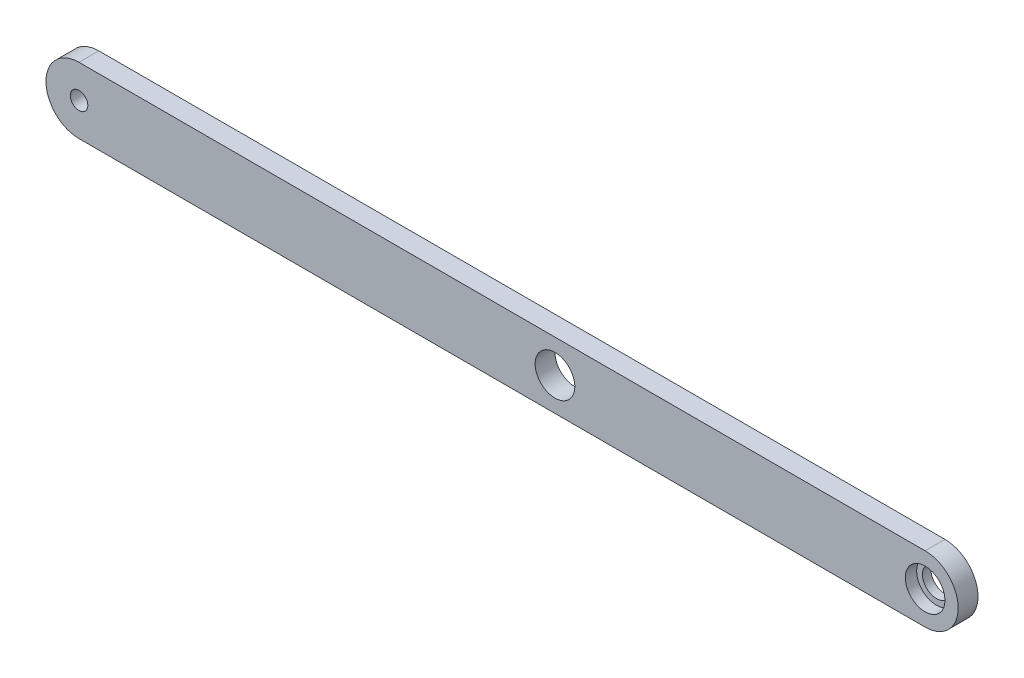
ISO-10303-21;
HEADER;
FILE_DESCRIPTION(('STEP AP214'),'2;1');
FILE_NAME('part.step','',(''),(''),'','','');
FILE_SCHEMA(('AUTOMOTIVE_DESIGN { 1 0 10303 214 1 1 1 1 }'));
ENDSEC;
DATA;
#1=APPLICATION_CONTEXT('core data for automotive mechanical design processes');
#2=APPLICATION_PROTOCOL_DEFINITION('international standard','automotive_design',2000,#1);
#3=PRODUCT_CONTEXT('',#1,'mechanical');
#4=PRODUCT('Part','Part','',(#3));
#5=PRODUCT_RELATED_PRODUCT_CATEGORY('part','',(#4));
#6=PRODUCT_DEFINITION_FORMATION('','',#4);
#7=PRODUCT_DEFINITION_CONTEXT('part definition',#1,'design');
#8=PRODUCT_DEFINITION('design','',#6,#7);
#9=PRODUCT_DEFINITION_SHAPE('','',#8);
#10=(LENGTH_UNIT() NAMED_UNIT(*) SI_UNIT(.MILLI.,.METRE.));
#11=(NAMED_UNIT(*) PLANE_ANGLE_UNIT() SI_UNIT($,.RADIAN.));
#12=(NAMED_UNIT(*) SI_UNIT($,.STERADIAN.) SOLID_ANGLE_UNIT());
#13=UNCERTAINTY_MEASURE_WITH_UNIT(LENGTH_MEASURE(1.E-05),#10,'distance_accuracy_value','');
#14=(GEOMETRIC_REPRESENTATION_CONTEXT(3) GLOBAL_UNCERTAINTY_ASSIGNED_CONTEXT((#13)) GLOBAL_UNIT_ASSIGNED_CONTEXT((#10,
#11,#12)) REPRESENTATION_CONTEXT('',''));
#15=CARTESIAN_POINT('',(0.,0.,0.));
#16=DIRECTION('',(0.,0.,1.));
#17=DIRECTION('',(1.,0.,0.));
#18=AXIS2_PLACEMENT_3D('',#15,#16,#17);
#19=CARTESIAN_POINT('',(0.,-7.93749999999999,4.7625));
#20=DIRECTION('',(0.,1.,0.));
#21=DIRECTION('',(0.,0.,1.));
#22=AXIS2_PLACEMENT_3D('',#19,#20,#21);
#23=PLANE('',#22);
#24=DIRECTION('',(1.,0.,0.));
#25=VECTOR('',#24,1.);
#26=CARTESIAN_POINT('',(0.,-7.93749999999999,0.));
#27=LINE('',#26,#25);
#28=CARTESIAN_POINT('',(-101.6,-7.93749999999999,0.));
#29=VERTEX_POINT('',#28);
#30=CARTESIAN_POINT('',(101.6,-7.93749999999999,0.));
#31=VERTEX_POINT('',#30);
#32=EDGE_CURVE('E113',#29,#31,#27,.T.);
#33=ORIENTED_EDGE('',*,*,#32,.T.);
#34=DIRECTION('',(0.,0.,-1.));
#35=VECTOR('',#34,1.);
#36=CARTESIAN_POINT('',(101.6,-7.93749999999999,4.7625));
#37=LINE('',#36,#35);
#38=CARTESIAN_POINT('',(101.6,-7.93749999999999,4.7625));
#39=VERTEX_POINT('',#38);
#40=EDGE_CURVE('E50',#39,#31,#37,.T.);
#41=ORIENTED_EDGE('',*,*,#40,.F.);
#42=DIRECTION('',(1.,0.,0.));
#43=VECTOR('',#42,1.);
#44=CARTESIAN_POINT('',(0.,-7.93749999999999,4.7625));
#45=LINE('',#44,#43);
#46=CARTESIAN_POINT('',(-101.6,-7.93749999999999,4.7625));
#47=VERTEX_POINT('',#46);
#48=EDGE_CURVE('E90',#47,#39,#45,.T.);
#49=ORIENTED_EDGE('',*,*,#48,.F.);
#50=DIRECTION('',(0.,0.,-1.));
#51=VECTOR('',#50,1.);
#52=CARTESIAN_POINT('',(-101.6,-7.93749999999999,4.7625));
#53=LINE('',#52,#51);
#54=EDGE_CURVE('E106',#47,#29,#53,.T.);
#55=ORIENTED_EDGE('',*,*,#54,.T.);
#56=EDGE_LOOP('',(#33,#41,#49,#55));
#57=FACE_BOUND('',#56,.T.);
#58=ADVANCED_FACE('F41',(#57),#23,.F.);
#59=CARTESIAN_POINT('',(101.6,0.,4.7625));
#60=DIRECTION('',(0.,0.,-1.));
#61=DIRECTION('',(-1.,0.,0.));
#62=AXIS2_PLACEMENT_3D('',#59,#60,#61);
#63=CYLINDRICAL_SURFACE('',#62,7.9375);
#64=CARTESIAN_POINT('',(101.6,0.,0.));
#65=DIRECTION('',(0.,0.,1.));
#66=DIRECTION('',(1.,0.,0.));
#67=AXIS2_PLACEMENT_3D('',#64,#65,#66);
#68=CIRCLE('',#67,7.9375);
#69=CARTESIAN_POINT('',(101.6,7.93750000000002,0.));
#70=VERTEX_POINT('',#69);
#71=EDGE_CURVE('E96',#31,#70,#68,.T.);
#72=ORIENTED_EDGE('',*,*,#71,.T.);
#73=DIRECTION('',(0.,0.,-1.));
#74=VECTOR('',#73,1.);
#75=CARTESIAN_POINT('',(101.6,7.93750000000002,4.7625));
#76=LINE('',#75,#74);
#77=CARTESIAN_POINT('',(101.6,7.93750000000002,4.7625));
#78=VERTEX_POINT('',#77);
#79=EDGE_CURVE('E94',#78,#70,#76,.T.);
#80=ORIENTED_EDGE('',*,*,#79,.F.);
#81=CARTESIAN_POINT('',(101.6,0.,4.7625));
#82=DIRECTION('',(0.,0.,1.));
#83=DIRECTION('',(1.,0.,0.));
#84=AXIS2_PLACEMENT_3D('',#81,#82,#83);
#85=CIRCLE('',#84,7.9375);
#86=EDGE_CURVE('E85',#39,#78,#85,.T.);
#87=ORIENTED_EDGE('',*,*,#86,.F.);
#88=ORIENTED_EDGE('',*,*,#40,.T.);
#89=EDGE_LOOP('',(#72,#80,#87,#88));
#90=FACE_BOUND('',#89,.T.);
#91=ADVANCED_FACE('F95',(#90),#63,.T.);
#92=CARTESIAN_POINT('',(0.,7.93750000000002,4.7625));
#93=DIRECTION('',(0.,1.,0.));
#94=DIRECTION('',(0.,0.,1.));
#95=AXIS2_PLACEMENT_3D('',#92,#93,#94);
#96=PLANE('',#95);
#97=DIRECTION('',(1.,0.,0.));
#98=VECTOR('',#97,1.);
#99=CARTESIAN_POINT('',(0.,7.93750000000002,0.));
#100=LINE('',#99,#98);
#101=CARTESIAN_POINT('',(-101.6,7.93750000000002,0.));
#102=VERTEX_POINT('',#101);
#103=EDGE_CURVE('E118',#102,#70,#100,.T.);
#104=ORIENTED_EDGE('',*,*,#103,.F.);
#105=DIRECTION('',(0.,0.,-1.));
#106=VECTOR('',#105,1.);
#107=CARTESIAN_POINT('',(-101.6,7.93750000000002,4.7625));
#108=LINE('',#107,#106);
#109=CARTESIAN_POINT('',(-101.6,7.93750000000002,4.7625));
#110=VERTEX_POINT('',#109);
#111=EDGE_CURVE('E74',#110,#102,#108,.T.);
#112=ORIENTED_EDGE('',*,*,#111,.F.);
#113=DIRECTION('',(1.,0.,0.));
#114=VECTOR('',#113,1.);
#115=CARTESIAN_POINT('',(0.,7.93750000000002,4.7625));
#116=LINE('',#115,#114);
#117=EDGE_CURVE('E88',#110,#78,#116,.T.);
#118=ORIENTED_EDGE('',*,*,#117,.T.);
#119=ORIENTED_EDGE('',*,*,#79,.T.);
#120=EDGE_LOOP('',(#104,#112,#118,#119));
#121=FACE_BOUND('',#120,.T.);
#122=ADVANCED_FACE('F101',(#121),#96,.T.);
#123=CARTESIAN_POINT('',(101.6,0.,4.7625));
#124=DIRECTION('',(0.,0.,-1.));
#125=DIRECTION('',(-1.,0.,0.));
#126=AXIS2_PLACEMENT_3D('',#123,#124,#125);
#127=CYLINDRICAL_SURFACE('',#126,4.7625);
#128=CARTESIAN_POINT('',(101.6,0.,2.032));
#129=DIRECTION('',(0.,0.,1.));
#130=DIRECTION('',(1.,0.,0.));
#131=AXIS2_PLACEMENT_3D('',#128,#129,#130);
#132=CIRCLE('',#131,4.7625);
#133=CARTESIAN_POINT('',(96.8375,0.,2.032));
#134=VERTEX_POINT('',#133);
#135=EDGE_CURVE('E11',#134,#134,#132,.T.);
#136=CARTESIAN_POINT('',(101.6,0.,4.7625));
#137=DIRECTION('',(0.,0.,1.));
#138=DIRECTION('',(1.,0.,0.));
#139=AXIS2_PLACEMENT_3D('',#136,#137,#138);
#140=CIRCLE('',#139,4.7625);
#141=CARTESIAN_POINT('',(96.8375,0.,4.7625));
#142=VERTEX_POINT('',#141);
#143=EDGE_CURVE('E146',#142,#142,#140,.T.);
#144=CARTESIAN_POINT('',(96.8375,0.,2.032));
#145=CARTESIAN_POINT('',(96.8375,0.,2.06044270833333));
#146=CARTESIAN_POINT('',(96.8375,0.,2.08888541666667));
#147=CARTESIAN_POINT('',(96.8375,0.,2.14577083333333));
#148=CARTESIAN_POINT('',(96.8375,0.,2.17421354166667));
#149=CARTESIAN_POINT('',(96.8375,0.,2.23109895833333));
#150=CARTESIAN_POINT('',(96.8375,0.,2.25954166666667));
#151=CARTESIAN_POINT('',(96.8375,0.,2.31642708333333));
#152=CARTESIAN_POINT('',(96.8375,0.,2.34486979166667));
#153=CARTESIAN_POINT('',(96.8375,0.,2.40175520833333));
#154=CARTESIAN_POINT('',(96.8375,0.,2.43019791666667));
#155=CARTESIAN_POINT('',(96.8375,0.,2.48708333333333));
#156=CARTESIAN_POINT('',(96.8375,0.,2.51552604166667));
#157=CARTESIAN_POINT('',(96.8375,0.,2.57241145833333));
#158=CARTESIAN_POINT('',(96.8375,0.,2.60085416666667));
#159=CARTESIAN_POINT('',(96.8375,0.,2.65773958333333));
#160=CARTESIAN_POINT('',(96.8375,0.,2.68618229166667));
#161=CARTESIAN_POINT('',(96.8375,0.,2.74306770833333));
#162=CARTESIAN_POINT('',(96.8375,0.,2.77151041666667));
#163=CARTESIAN_POINT('',(96.8375,0.,2.82839583333333));
#164=CARTESIAN_POINT('',(96.8375,0.,2.85683854166667));
#165=CARTESIAN_POINT('',(96.8375,0.,2.91372395833333));
#166=CARTESIAN_POINT('',(96.8375,0.,2.94216666666667));
#167=CARTESIAN_POINT('',(96.8375,0.,2.99905208333333));
#168=CARTESIAN_POINT('',(96.8375,0.,3.02749479166667));
#169=CARTESIAN_POINT('',(96.8375,0.,3.08438020833333));
#170=CARTESIAN_POINT('',(96.8375,0.,3.11282291666667));
#171=CARTESIAN_POINT('',(96.8375,0.,3.16970833333333));
#172=CARTESIAN_POINT('',(96.8375,0.,3.19815104166667));
#173=CARTESIAN_POINT('',(96.8375,0.,3.25503645833333));
#174=CARTESIAN_POINT('',(96.8375,0.,3.28347916666667));
#175=CARTESIAN_POINT('',(96.8375,0.,3.34036458333333));
#176=CARTESIAN_POINT('',(96.8375,0.,3.36880729166667));
#177=CARTESIAN_POINT('',(96.8375,0.,3.42569270833333));
#178=CARTESIAN_POINT('',(96.8375,0.,3.45413541666667));
#179=CARTESIAN_POINT('',(96.8375,0.,3.51102083333333));
#180=CARTESIAN_POINT('',(96.8375,0.,3.53946354166667));
#181=CARTESIAN_POINT('',(96.8375,0.,3.59634895833333));
#182=CARTESIAN_POINT('',(96.8375,0.,3.62479166666667));
#183=CARTESIAN_POINT('',(96.8375,0.,3.68167708333333));
#184=CARTESIAN_POINT('',(96.8375,0.,3.71011979166667));
#185=CARTESIAN_POINT('',(96.8375,0.,3.76700520833333));
#186=CARTESIAN_POINT('',(96.8375,0.,3.79544791666667));
#187=CARTESIAN_POINT('',(96.8375,0.,3.85233333333333));
#188=CARTESIAN_POINT('',(96.8375,0.,3.88077604166667));
#189=CARTESIAN_POINT('',(96.8375,0.,3.93766145833333));
#190=CARTESIAN_POINT('',(96.8375,0.,3.96610416666667));
#191=CARTESIAN_POINT('',(96.8375,0.,4.02298958333333));
#192=CARTESIAN_POINT('',(96.8375,0.,4.05143229166667));
#193=CARTESIAN_POINT('',(96.8375,0.,4.10831770833333));
#194=CARTESIAN_POINT('',(96.8375,0.,4.13676041666667));
#195=CARTESIAN_POINT('',(96.8375,0.,4.19364583333333));
#196=CARTESIAN_POINT('',(96.8375,0.,4.22208854166667));
#197=CARTESIAN_POINT('',(96.8375,0.,4.27897395833333));
#198=CARTESIAN_POINT('',(96.8375,0.,4.30741666666667));
#199=CARTESIAN_POINT('',(96.8375,0.,4.36430208333333));
#200=CARTESIAN_POINT('',(96.8375,0.,4.39274479166667));
#201=CARTESIAN_POINT('',(96.8375,0.,4.44963020833333));
#202=CARTESIAN_POINT('',(96.8375,0.,4.47807291666667));
#203=CARTESIAN_POINT('',(96.8375,0.,4.53495833333333));
#204=CARTESIAN_POINT('',(96.8375,0.,4.56340104166667));
#205=CARTESIAN_POINT('',(96.8375,0.,4.62028645833333));
#206=CARTESIAN_POINT('',(96.8375,0.,4.64872916666667));
#207=CARTESIAN_POINT('',(96.8375,0.,4.70561458333333));
#208=CARTESIAN_POINT('',(96.8375,0.,4.73405729166667));
#209=CARTESIAN_POINT('',(96.8375,0.,4.7625));
#210=B_SPLINE_CURVE_WITH_KNOTS('',3,(#144,#145,#146,#147,#148,#149,#150,#151,#152,#153,#154,
#155,#156,#157,#158,#159,#160,#161,#162,#163,#164,#165,#166,#167,#168,#169,#170,#171,#172,#173,
#174,#175,#176,#177,#178,#179,#180,#181,#182,#183,#184,#185,#186,#187,#188,#189,#190,#191,#192,
#193,#194,#195,#196,#197,#198,#199,#200,#201,#202,#203,#204,#205,#206,#207,#208,#209),
.UNSPECIFIED.,.F.,.F.,(4,2,2,2,2,2,2,2,2,2,2,2,2,2,2,2,2,2,2,2,2,2,2,2,2,2,2,2,2,2,2,2,4),(0.,
0.0853281249999999,0.17065625,0.255984375,0.3413125,0.426640625,0.51196875,0.597296875,0.682625,
0.767953125,0.85328125,0.938609375,1.0239375,1.109265625,1.19459375,1.279921875,1.36525,
1.450578125,1.53590625,1.621234375,1.7065625,1.791890625,1.87721875,1.962546875,2.047875,
2.133203125,2.21853125,2.303859375,2.3891875,2.474515625,2.55984375,2.645171875,2.7305),.UNSPECIFIED.);
#211=EDGE_CURVE('BSEAM151',#134,#142,#210,.T.);
#212=ORIENTED_EDGE('',*,*,#135,.F.);
#213=ORIENTED_EDGE('',*,*,#143,.T.);
#214=ORIENTED_EDGE('',*,*,#211,.T.);
#215=ORIENTED_EDGE('',*,*,#211,.F.);
#216=EDGE_LOOP('',(#212,#214,#213,#215));
#217=FACE_BOUND('',#216,.T.);
#218=ADVANCED_FACE('F151',(#217),#127,.F.);
#219=CARTESIAN_POINT('',(12.7,0.,4.7625));
#220=DIRECTION('',(0.,0.,-1.));
#221=DIRECTION('',(-1.,0.,0.));
#222=AXIS2_PLACEMENT_3D('',#219,#220,#221);
#223=CYLINDRICAL_SURFACE('',#222,4.7625);
#224=CARTESIAN_POINT('',(12.7,0.,4.7625));
#225=DIRECTION('',(0.,0.,1.));
#226=DIRECTION('',(1.,0.,0.));
#227=AXIS2_PLACEMENT_3D('',#224,#225,#226);
#228=CIRCLE('',#227,4.7625);
#229=CARTESIAN_POINT('',(7.9375,0.,4.7625));
#230=VERTEX_POINT('',#229);
#231=EDGE_CURVE('E121',#230,#230,#228,.T.);
#232=CARTESIAN_POINT('',(12.7,0.,0.));
#233=DIRECTION('',(0.,0.,1.));
#234=DIRECTION('',(1.,0.,0.));
#235=AXIS2_PLACEMENT_3D('',#232,#233,#234);
#236=CIRCLE('',#235,4.7625);
#237=CARTESIAN_POINT('',(7.9375,0.,0.));
#238=VERTEX_POINT('',#237);
#239=EDGE_CURVE('E110',#238,#238,#236,.T.);
#240=CARTESIAN_POINT('',(7.9375,0.,4.7625));
#241=CARTESIAN_POINT('',(7.9375,0.,4.712890625));
#242=CARTESIAN_POINT('',(7.9375,0.,4.66328125));
#243=CARTESIAN_POINT('',(7.9375,0.,4.5640625));
#244=CARTESIAN_POINT('',(7.9375,0.,4.514453125));
#245=CARTESIAN_POINT('',(7.9375,0.,4.415234375));
#246=CARTESIAN_POINT('',(7.9375,0.,4.365625));
#247=CARTESIAN_POINT('',(7.9375,0.,4.26640625));
#248=CARTESIAN_POINT('',(7.9375,0.,4.216796875));
#249=CARTESIAN_POINT('',(7.9375,0.,4.117578125));
#250=CARTESIAN_POINT('',(7.9375,0.,4.06796875));
#251=CARTESIAN_POINT('',(7.9375,0.,3.96875));
#252=CARTESIAN_POINT('',(7.9375,0.,3.919140625));
#253=CARTESIAN_POINT('',(7.9375,0.,3.819921875));
#254=CARTESIAN_POINT('',(7.9375,0.,3.7703125));
#255=CARTESIAN_POINT('',(7.9375,0.,3.67109375));
#256=CARTESIAN_POINT('',(7.9375,0.,3.621484375));
#257=CARTESIAN_POINT('',(7.9375,0.,3.522265625));
#258=CARTESIAN_POINT('',(7.9375,0.,3.47265625));
#259=CARTESIAN_POINT('',(7.9375,0.,3.3734375));
#260=CARTESIAN_POINT('',(7.9375,0.,3.323828125));
#261=CARTESIAN_POINT('',(7.9375,0.,3.224609375));
#262=CARTESIAN_POINT('',(7.9375,0.,3.175));
#263=CARTESIAN_POINT('',(7.9375,0.,3.07578125));
#264=CARTESIAN_POINT('',(7.9375,0.,3.026171875));
#265=CARTESIAN_POINT('',(7.9375,0.,2.926953125));
#266=CARTESIAN_POINT('',(7.9375,0.,2.87734375));
#267=CARTESIAN_POINT('',(7.9375,0.,2.778125));
#268=CARTESIAN_POINT('',(7.9375,0.,2.728515625));
#269=CARTESIAN_POINT('',(7.9375,0.,2.629296875));
#270=CARTESIAN_POINT('',(7.9375,0.,2.5796875));
#271=CARTESIAN_POINT('',(7.9375,0.,2.48046875));
#272=CARTESIAN_POINT('',(7.9375,0.,2.430859375));
#273=CARTESIAN_POINT('',(7.9375,0.,2.331640625));
#274=CARTESIAN_POINT('',(7.9375,0.,2.28203125));
#275=CARTESIAN_POINT('',(7.9375,0.,2.1828125));
#276=CARTESIAN_POINT('',(7.9375,0.,2.133203125));
#277=CARTESIAN_POINT('',(7.9375,0.,2.033984375));
#278=CARTESIAN_POINT('',(7.9375,0.,1.984375));
#279=CARTESIAN_POINT('',(7.9375,0.,1.88515625));
#280=CARTESIAN_POINT('',(7.9375,0.,1.835546875));
#281=CARTESIAN_POINT('',(7.9375,0.,1.736328125));
#282=CARTESIAN_POINT('',(7.9375,0.,1.68671875));
#283=CARTESIAN_POINT('',(7.9375,0.,1.5875));
#284=CARTESIAN_POINT('',(7.9375,0.,1.537890625));
#285=CARTESIAN_POINT('',(7.9375,0.,1.438671875));
#286=CARTESIAN_POINT('',(7.9375,0.,1.3890625));
#287=CARTESIAN_POINT('',(7.9375,0.,1.28984375));
#288=CARTESIAN_POINT('',(7.9375,0.,1.240234375));
#289=CARTESIAN_POINT('',(7.9375,0.,1.141015625));
#290=CARTESIAN_POINT('',(7.9375,0.,1.09140625));
#291=CARTESIAN_POINT('',(7.9375,0.,0.992187499999999));
#292=CARTESIAN_POINT('',(7.9375,0.,0.942578124999999));
#293=CARTESIAN_POINT('',(7.9375,0.,0.843359375));
#294=CARTESIAN_POINT('',(7.9375,0.,0.79375));
#295=CARTESIAN_POINT('',(7.9375,0.,0.69453125));
#296=CARTESIAN_POINT('',(7.9375,0.,0.644921875));
#297=CARTESIAN_POINT('',(7.9375,0.,0.545703125));
#298=CARTESIAN_POINT('',(7.9375,0.,0.49609375));
#299=CARTESIAN_POINT('',(7.9375,0.,0.396875));
#300=CARTESIAN_POINT('',(7.9375,0.,0.347265625));
#301=CARTESIAN_POINT('',(7.9375,0.,0.248046875));
#302=CARTESIAN_POINT('',(7.9375,0.,0.1984375));
#303=CARTESIAN_POINT('',(7.9375,0.,0.09921875));
#304=CARTESIAN_POINT('',(7.9375,0.,0.049609375));
#305=CARTESIAN_POINT('',(7.9375,0.,0.));
#306=B_SPLINE_CURVE_WITH_KNOTS('',3,(#240,#241,#242,#243,#244,#245,#246,#247,#248,#249,#250,
#251,#252,#253,#254,#255,#256,#257,#258,#259,#260,#261,#262,#263,#264,#265,#266,#267,#268,#269,
#270,#271,#272,#273,#274,#275,#276,#277,#278,#279,#280,#281,#282,#283,#284,#285,#286,#287,#288,
#289,#290,#291,#292,#293,#294,#295,#296,#297,#298,#299,#300,#301,#302,#303,#304,#305),
.UNSPECIFIED.,.F.,.F.,(4,2,2,2,2,2,2,2,2,2,2,2,2,2,2,2,2,2,2,2,2,2,2,2,2,2,2,2,2,2,2,2,4),(0.,
0.148828125,0.29765625,0.446484375,0.5953125,0.744140625,0.892968750000001,1.041796875,1.190625,
1.339453125,1.48828125,1.637109375,1.7859375,1.934765625,2.08359375,2.232421875,2.38125,
2.530078125,2.67890625,2.827734375,2.9765625,3.125390625,3.27421875,3.423046875,3.571875,
3.720703125,3.86953125,4.018359375,4.1671875,4.316015625,4.46484375,4.613671875,4.7625),.UNSPECIFIED.);
#307=EDGE_CURVE('BSEAM43',#230,#238,#306,.T.);
#308=ORIENTED_EDGE('',*,*,#231,.T.);
#309=ORIENTED_EDGE('',*,*,#239,.F.);
#310=ORIENTED_EDGE('',*,*,#307,.T.);
#311=ORIENTED_EDGE('',*,*,#307,.F.);
#312=EDGE_LOOP('',(#308,#310,#309,#311));
#313=FACE_BOUND('',#312,.T.);
#314=ADVANCED_FACE('F43',(#313),#223,.F.);
#315=CARTESIAN_POINT('',(-101.6,0.,4.7625));
#316=DIRECTION('',(0.,0.,-1.));
#317=DIRECTION('',(-1.,0.,0.));
#318=AXIS2_PLACEMENT_3D('',#315,#316,#317);
#319=CYLINDRICAL_SURFACE('',#318,7.9375);
#320=CARTESIAN_POINT('',(-101.6,0.,0.));
#321=DIRECTION('',(0.,0.,1.));
#322=DIRECTION('',(1.,0.,0.));
#323=AXIS2_PLACEMENT_3D('',#320,#321,#322);
#324=CIRCLE('',#323,7.9375);
#325=EDGE_CURVE('E77',#102,#29,#324,.T.);
#326=ORIENTED_EDGE('',*,*,#325,.T.);
#327=ORIENTED_EDGE('',*,*,#54,.F.);
#328=CARTESIAN_POINT('',(-101.6,0.,4.7625));
#329=DIRECTION('',(0.,0.,1.));
#330=DIRECTION('',(1.,0.,0.));
#331=AXIS2_PLACEMENT_3D('',#328,#329,#330);
#332=CIRCLE('',#331,7.9375);
#333=EDGE_CURVE('E58',#110,#47,#332,.T.);
#334=ORIENTED_EDGE('',*,*,#333,.F.);
#335=ORIENTED_EDGE('',*,*,#111,.T.);
#336=EDGE_LOOP('',(#326,#327,#334,#335));
#337=FACE_BOUND('',#336,.T.);
#338=ADVANCED_FACE('F154',(#337),#319,.T.);
#339=CARTESIAN_POINT('',(0.,0.,4.7625));
#340=DIRECTION('',(0.,0.,1.));
#341=DIRECTION('',(1.,0.,0.));
#342=AXIS2_PLACEMENT_3D('',#339,#340,#341);
#343=PLANE('',#342);
#344=CARTESIAN_POINT('',(-101.6,0.,4.7625));
#345=DIRECTION('',(0.,0.,1.));
#346=DIRECTION('',(1.,0.,0.));
#347=AXIS2_PLACEMENT_3D('',#344,#345,#346);
#348=CIRCLE('',#347,2.1);
#349=CARTESIAN_POINT('',(-99.5,0.,4.7625));
#350=VERTEX_POINT('',#349);
#351=EDGE_CURVE('E141',#350,#350,#348,.T.);
#352=ORIENTED_EDGE('',*,*,#351,.F.);
#353=EDGE_LOOP('',(#352));
#354=FACE_BOUND('',#353,.T.);
#355=ORIENTED_EDGE('',*,*,#231,.F.);
#356=EDGE_LOOP('',(#355));
#357=FACE_BOUND('',#356,.T.);
#358=ORIENTED_EDGE('',*,*,#143,.F.);
#359=EDGE_LOOP('',(#358));
#360=FACE_BOUND('',#359,.T.);
#361=ORIENTED_EDGE('',*,*,#48,.T.);
#362=ORIENTED_EDGE('',*,*,#86,.T.);
#363=ORIENTED_EDGE('',*,*,#117,.F.);
#364=ORIENTED_EDGE('',*,*,#333,.T.);
#365=EDGE_LOOP('',(#361,#362,#363,#364));
#366=FACE_BOUND('',#365,.T.);
#367=ADVANCED_FACE('F86',(#354,#357,#360,#366),#343,.T.);
#368=CARTESIAN_POINT('',(0.,0.,0.));
#369=DIRECTION('',(0.,0.,1.));
#370=DIRECTION('',(1.,0.,0.));
#371=AXIS2_PLACEMENT_3D('',#368,#369,#370);
#372=PLANE('',#371);
#373=CARTESIAN_POINT('',(-101.6,0.,0.));
#374=DIRECTION('',(0.,0.,1.));
#375=DIRECTION('',(1.,0.,0.));
#376=AXIS2_PLACEMENT_3D('',#373,#374,#375);
#377=CIRCLE('',#376,2.1);
#378=CARTESIAN_POINT('',(-99.5,0.,0.));
#379=VERTEX_POINT('',#378);
#380=EDGE_CURVE('E136',#379,#379,#377,.T.);
#381=ORIENTED_EDGE('',*,*,#380,.T.);
#382=EDGE_LOOP('',(#381));
#383=FACE_BOUND('',#382,.T.);
#384=ORIENTED_EDGE('',*,*,#239,.T.);
#385=EDGE_LOOP('',(#384));
#386=FACE_BOUND('',#385,.T.);
#387=ORIENTED_EDGE('',*,*,#32,.F.);
#388=ORIENTED_EDGE('',*,*,#325,.F.);
#389=ORIENTED_EDGE('',*,*,#103,.T.);
#390=ORIENTED_EDGE('',*,*,#71,.F.);
#391=EDGE_LOOP('',(#387,#388,#389,#390));
#392=FACE_BOUND('',#391,.T.);
#393=CARTESIAN_POINT('',(101.6,0.,0.));
#394=DIRECTION('',(0.,0.,1.));
#395=DIRECTION('',(1.,0.,0.));
#396=AXIS2_PLACEMENT_3D('',#393,#394,#395);
#397=CIRCLE('',#396,3.3734375);
#398=CARTESIAN_POINT('',(104.9734375,0.,0.));
#399=VERTEX_POINT('',#398);
#400=EDGE_CURVE('E134',#399,#399,#397,.T.);
#401=ORIENTED_EDGE('',*,*,#400,.T.);
#402=EDGE_LOOP('',(#401));
#403=FACE_BOUND('',#402,.T.);
#404=ADVANCED_FACE('F126',(#383,#386,#392,#403),#372,.F.);
#405=CARTESIAN_POINT('',(101.6,0.,2.032));
#406=DIRECTION('',(0.,0.,-1.));
#407=DIRECTION('',(-1.,0.,0.));
#408=AXIS2_PLACEMENT_3D('',#405,#406,#407);
#409=CYLINDRICAL_SURFACE('',#408,3.3734375);
#410=CARTESIAN_POINT('',(101.6,0.,2.032));
#411=DIRECTION('',(0.,0.,1.));
#412=DIRECTION('',(1.,0.,0.));
#413=AXIS2_PLACEMENT_3D('',#410,#411,#412);
#414=CIRCLE('',#413,3.3734375);
#415=CARTESIAN_POINT('',(104.9734375,0.,2.032));
#416=VERTEX_POINT('',#415);
#417=EDGE_CURVE('E114',#416,#416,#414,.T.);
#418=ORIENTED_EDGE('',*,*,#417,.T.);
#419=EDGE_LOOP('',(#418));
#420=FACE_BOUND('',#419,.T.);
#421=ORIENTED_EDGE('',*,*,#400,.F.);
#422=EDGE_LOOP('',(#421));
#423=FACE_BOUND('',#422,.T.);
#424=ADVANCED_FACE('F129',(#420,#423),#409,.F.);
#425=CARTESIAN_POINT('',(0.,0.,2.032));
#426=DIRECTION('',(0.,0.,1.));
#427=DIRECTION('',(1.,0.,0.));
#428=AXIS2_PLACEMENT_3D('',#425,#426,#427);
#429=PLANE('',#428);
#430=ORIENTED_EDGE('',*,*,#417,.F.);
#431=EDGE_LOOP('',(#430));
#432=FACE_BOUND('',#431,.T.);
#433=ORIENTED_EDGE('',*,*,#135,.T.);
#434=EDGE_LOOP('',(#433));
#435=FACE_BOUND('',#434,.T.);
#436=ADVANCED_FACE('F180',(#432,#435),#429,.T.);
#437=CARTESIAN_POINT('',(-101.6,0.,4.7625));
#438=DIRECTION('',(0.,0.,1.));
#439=DIRECTION('',(1.,0.,0.));
#440=AXIS2_PLACEMENT_3D('',#437,#438,#439);
#441=CYLINDRICAL_SURFACE('',#440,2.1);
#442=ORIENTED_EDGE('',*,*,#351,.T.);
#443=EDGE_LOOP('',(#442));
#444=FACE_BOUND('',#443,.T.);
#445=ORIENTED_EDGE('',*,*,#380,.F.);
#446=EDGE_LOOP('',(#445));
#447=FACE_BOUND('',#446,.T.);
#448=ADVANCED_FACE('F182',(#444,#447),#441,.F.);
#449=CLOSED_SHELL('',(#58,#91,#122,#218,#314,#338,#367,#404,#424,#436,#448));
#450=MANIFOLD_SOLID_BREP('B2',#449);
#451=ADVANCED_BREP_SHAPE_REPRESENTATION('',(#18,#450),#14);
#452=SHAPE_DEFINITION_REPRESENTATION(#9,#451);
ENDSEC;
END-ISO-10303-21;
